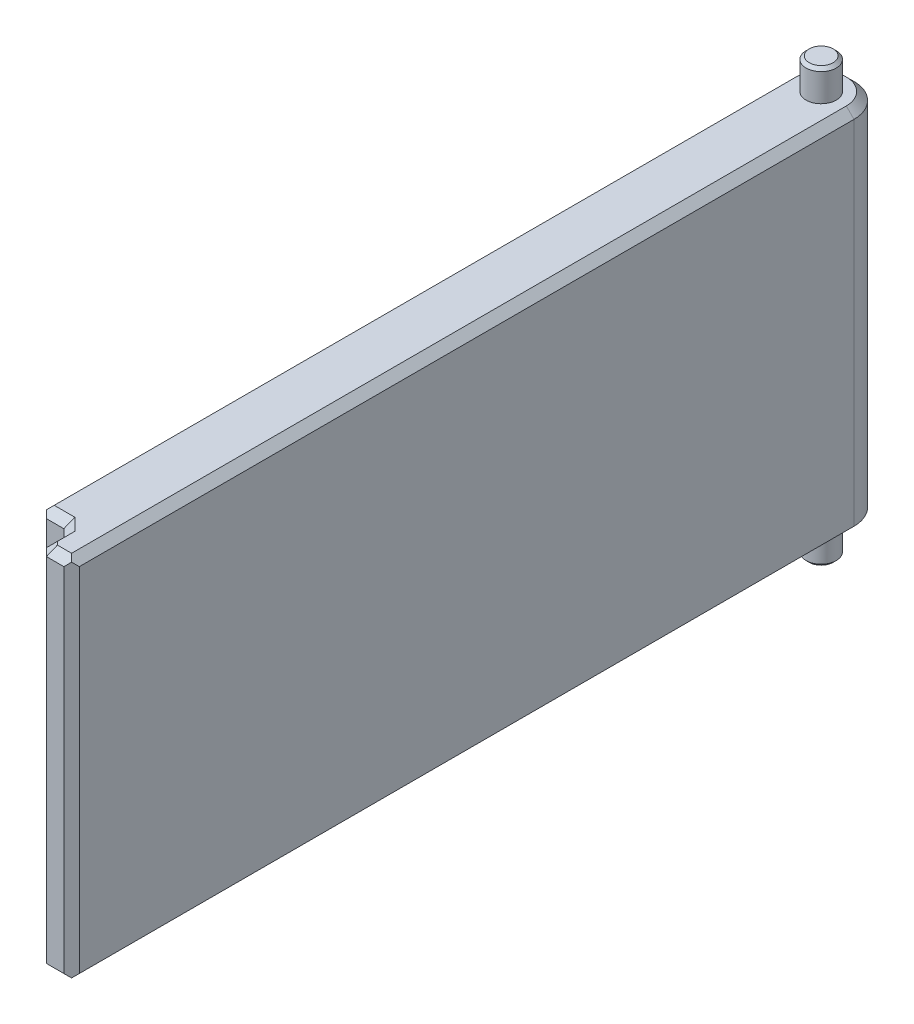
ISO-10303-21;
HEADER;
FILE_DESCRIPTION(('STEP AP214'),'2;1');
FILE_NAME('part.step','',(''),(''),'','','');
FILE_SCHEMA(('AUTOMOTIVE_DESIGN { 1 0 10303 214 1 1 1 1 }'));
ENDSEC;
DATA;
#1=APPLICATION_CONTEXT('core data for automotive mechanical design processes');
#2=APPLICATION_PROTOCOL_DEFINITION('international standard','automotive_design',2000,#1);
#3=PRODUCT_CONTEXT('',#1,'mechanical');
#4=PRODUCT('Part','Part','',(#3));
#5=PRODUCT_RELATED_PRODUCT_CATEGORY('part','',(#4));
#6=PRODUCT_DEFINITION_FORMATION('','',#4);
#7=PRODUCT_DEFINITION_CONTEXT('part definition',#1,'design');
#8=PRODUCT_DEFINITION('design','',#6,#7);
#9=PRODUCT_DEFINITION_SHAPE('','',#8);
#10=(LENGTH_UNIT() NAMED_UNIT(*) SI_UNIT(.MILLI.,.METRE.));
#11=(NAMED_UNIT(*) PLANE_ANGLE_UNIT() SI_UNIT($,.RADIAN.));
#12=(NAMED_UNIT(*) SI_UNIT($,.STERADIAN.) SOLID_ANGLE_UNIT());
#13=UNCERTAINTY_MEASURE_WITH_UNIT(LENGTH_MEASURE(1.E-05),#10,'distance_accuracy_value','');
#14=(GEOMETRIC_REPRESENTATION_CONTEXT(3) GLOBAL_UNCERTAINTY_ASSIGNED_CONTEXT((#13)) GLOBAL_UNIT_ASSIGNED_CONTEXT((#10,
#11,#12)) REPRESENTATION_CONTEXT('',''));
#15=CARTESIAN_POINT('',(0.,0.,0.));
#16=DIRECTION('',(0.,0.,1.));
#17=DIRECTION('',(1.,0.,0.));
#18=AXIS2_PLACEMENT_3D('',#15,#16,#17);
#19=CARTESIAN_POINT('',(0.,28.,0.));
#20=DIRECTION('',(0.,-1.,0.));
#21=DIRECTION('',(0.,0.,-1.));
#22=AXIS2_PLACEMENT_3D('',#19,#20,#21);
#23=CYLINDRICAL_SURFACE('',#22,0.975);
#24=CARTESIAN_POINT('',(0.,2.2,0.));
#25=DIRECTION('',(0.,-1.,0.));
#26=DIRECTION('',(0.,0.,-1.));
#27=AXIS2_PLACEMENT_3D('',#24,#25,#26);
#28=CIRCLE('',#27,0.975);
#29=CARTESIAN_POINT('',(0.,2.2,-0.975));
#30=VERTEX_POINT('',#29);
#31=EDGE_CURVE('E11',#30,#30,#28,.F.);
#32=ORIENTED_EDGE('',*,*,#31,.T.);
#33=EDGE_LOOP('',(#32));
#34=FACE_BOUND('',#33,.T.);
#35=CARTESIAN_POINT('',(0.,4.2,0.));
#36=DIRECTION('',(0.,1.,0.));
#37=DIRECTION('',(0.,0.,1.));
#38=AXIS2_PLACEMENT_3D('',#35,#36,#37);
#39=CIRCLE('',#38,0.975);
#40=CARTESIAN_POINT('',(0.,4.2,0.975));
#41=VERTEX_POINT('',#40);
#42=EDGE_CURVE('E192',#41,#41,#39,.T.);
#43=ORIENTED_EDGE('',*,*,#42,.F.);
#44=EDGE_LOOP('',(#43));
#45=FACE_BOUND('',#44,.T.);
#46=ADVANCED_FACE('F43',(#34,#45),#23,.T.);
#47=CARTESIAN_POINT('',(0.,4.2,50.625));
#48=DIRECTION('',(-1.,0.,0.));
#49=DIRECTION('',(0.,0.,1.));
#50=AXIS2_PLACEMENT_3D('',#47,#48,#49);
#51=PLANE('',#50);
#52=DIRECTION('',(0.,1.,0.));
#53=VECTOR('',#52,1.);
#54=CARTESIAN_POINT('',(0.,4.2,50.125));
#55=LINE('',#54,#53);
#56=CARTESIAN_POINT('',(0.,4.70000000000001,50.125));
#57=VERTEX_POINT('',#56);
#58=CARTESIAN_POINT('',(0.,27.5,50.125));
#59=VERTEX_POINT('',#58);
#60=EDGE_CURVE('E287',#57,#59,#55,.T.);
#61=ORIENTED_EDGE('',*,*,#60,.T.);
#62=DIRECTION('',(0.,0.,-1.));
#63=VECTOR('',#62,1.);
#64=CARTESIAN_POINT('',(0.,27.5,50.625));
#65=LINE('',#64,#63);
#66=CARTESIAN_POINT('',(0.,27.5,49.));
#67=VERTEX_POINT('',#66);
#68=EDGE_CURVE('E338',#59,#67,#65,.T.);
#69=ORIENTED_EDGE('',*,*,#68,.T.);
#70=DIRECTION('',(0.,-1.,0.));
#71=VECTOR('',#70,1.);
#72=CARTESIAN_POINT('',(0.,4.2,49.));
#73=LINE('',#72,#71);
#74=CARTESIAN_POINT('',(0.,4.70000000000001,49.));
#75=VERTEX_POINT('',#74);
#76=EDGE_CURVE('E291',#67,#75,#73,.T.);
#77=ORIENTED_EDGE('',*,*,#76,.T.);
#78=DIRECTION('',(0.,0.,1.));
#79=VECTOR('',#78,1.);
#80=CARTESIAN_POINT('',(0.,4.70000000000001,50.125));
#81=LINE('',#80,#79);
#82=EDGE_CURVE('E335',#75,#57,#81,.T.);
#83=ORIENTED_EDGE('',*,*,#82,.T.);
#84=EDGE_LOOP('',(#61,#69,#77,#83));
#85=FACE_BOUND('',#84,.T.);
#86=ADVANCED_FACE('F435',(#85),#51,.T.);
#87=CARTESIAN_POINT('',(0.,4.2,48.5));
#88=DIRECTION('',(0.,0.,1.));
#89=DIRECTION('',(1.,0.,0.));
#90=AXIS2_PLACEMENT_3D('',#87,#88,#89);
#91=PLANE('',#90);
#92=DIRECTION('',(0.,1.,0.));
#93=VECTOR('',#92,1.);
#94=CARTESIAN_POINT('',(-0.499999999999996,28.,48.5));
#95=LINE('',#94,#93);
#96=CARTESIAN_POINT('',(-0.499999999999996,4.70000000000001,48.5));
#97=VERTEX_POINT('',#96);
#98=CARTESIAN_POINT('',(-0.499999999999996,27.5,48.5));
#99=VERTEX_POINT('',#98);
#100=EDGE_CURVE('E283',#97,#99,#95,.T.);
#101=ORIENTED_EDGE('',*,*,#100,.T.);
#102=DIRECTION('',(-1.,0.,0.));
#103=VECTOR('',#102,1.);
#104=CARTESIAN_POINT('',(0.,27.5,48.5));
#105=LINE('',#104,#103);
#106=CARTESIAN_POINT('',(-1.62499999999999,27.5,48.5));
#107=VERTEX_POINT('',#106);
#108=EDGE_CURVE('E317',#99,#107,#105,.T.);
#109=ORIENTED_EDGE('',*,*,#108,.T.);
#110=DIRECTION('',(0.,-1.,0.));
#111=VECTOR('',#110,1.);
#112=CARTESIAN_POINT('',(-1.62499999999999,4.2,48.5));
#113=LINE('',#112,#111);
#114=CARTESIAN_POINT('',(-1.62499999999999,4.70000000000001,48.5));
#115=VERTEX_POINT('',#114);
#116=EDGE_CURVE('E262',#107,#115,#113,.T.);
#117=ORIENTED_EDGE('',*,*,#116,.T.);
#118=DIRECTION('',(1.,0.,0.));
#119=VECTOR('',#118,1.);
#120=CARTESIAN_POINT('',(-0.499999999999996,4.70000000000001,48.5));
#121=LINE('',#120,#119);
#122=EDGE_CURVE('E314',#115,#97,#121,.T.);
#123=ORIENTED_EDGE('',*,*,#122,.T.);
#124=EDGE_LOOP('',(#101,#109,#117,#123));
#125=FACE_BOUND('',#124,.T.);
#126=ADVANCED_FACE('F441',(#125),#91,.T.);
#127=CARTESIAN_POINT('',(-2.125,4.2,0.));
#128=DIRECTION('',(-1.,0.,0.));
#129=DIRECTION('',(0.,0.,1.));
#130=AXIS2_PLACEMENT_3D('',#127,#128,#129);
#131=PLANE('',#130);
#132=DIRECTION('',(0.,0.,1.));
#133=VECTOR('',#132,1.);
#134=CARTESIAN_POINT('',(-2.12499999999999,4.7000000000001,48.5));
#135=LINE('',#134,#133);
#136=CARTESIAN_POINT('',(-2.125,4.7000000000001,0.));
#137=VERTEX_POINT('',#136);
#138=CARTESIAN_POINT('',(-2.12499999999999,4.7000000000001,48.));
#139=VERTEX_POINT('',#138);
#140=EDGE_CURVE('E213',#137,#139,#135,.T.);
#141=ORIENTED_EDGE('',*,*,#140,.T.);
#142=DIRECTION('',(0.,1.,0.));
#143=VECTOR('',#142,1.);
#144=CARTESIAN_POINT('',(-2.12499999999999,4.2,48.));
#145=LINE('',#144,#143);
#146=CARTESIAN_POINT('',(-2.12499999999999,27.5,48.));
#147=VERTEX_POINT('',#146);
#148=EDGE_CURVE('E243',#139,#147,#145,.T.);
#149=ORIENTED_EDGE('',*,*,#148,.T.);
#150=DIRECTION('',(0.,0.,-1.));
#151=VECTOR('',#150,1.);
#152=CARTESIAN_POINT('',(-2.125,27.5,0.));
#153=LINE('',#152,#151);
#154=CARTESIAN_POINT('',(-2.125,27.5,0.));
#155=VERTEX_POINT('',#154);
#156=EDGE_CURVE('E220',#147,#155,#153,.T.);
#157=ORIENTED_EDGE('',*,*,#156,.T.);
#158=DIRECTION('',(0.,1.,0.));
#159=VECTOR('',#158,1.);
#160=CARTESIAN_POINT('',(-2.125,4.2,0.));
#161=LINE('',#160,#159);
#162=EDGE_CURVE('E636',#137,#155,#161,.T.);
#163=ORIENTED_EDGE('',*,*,#162,.F.);
#164=EDGE_LOOP('',(#141,#149,#157,#163));
#165=FACE_BOUND('',#164,.T.);
#166=ADVANCED_FACE('F600',(#165),#131,.T.);
#167=CARTESIAN_POINT('',(0.,4.2,0.));
#168=DIRECTION('',(0.,1.,0.));
#169=DIRECTION('',(0.,0.,1.));
#170=AXIS2_PLACEMENT_3D('',#167,#168,#169);
#171=CYLINDRICAL_SURFACE('',#170,2.125);
#172=ORIENTED_EDGE('',*,*,#162,.T.);
#173=CARTESIAN_POINT('',(0.,27.5,0.));
#174=DIRECTION('',(0.,1.,0.));
#175=DIRECTION('',(0.,0.,1.));
#176=AXIS2_PLACEMENT_3D('',#173,#174,#175);
#177=CIRCLE('',#176,2.125);
#178=CARTESIAN_POINT('',(2.125,27.5,0.));
#179=VERTEX_POINT('',#178);
#180=EDGE_CURVE('E226',#155,#179,#177,.F.);
#181=ORIENTED_EDGE('',*,*,#180,.T.);
#182=DIRECTION('',(0.,1.,0.));
#183=VECTOR('',#182,1.);
#184=CARTESIAN_POINT('',(2.125,4.2,0.));
#185=LINE('',#184,#183);
#186=CARTESIAN_POINT('',(2.125,4.7000000000001,0.));
#187=VERTEX_POINT('',#186);
#188=EDGE_CURVE('E637',#187,#179,#185,.T.);
#189=ORIENTED_EDGE('',*,*,#188,.F.);
#190=CARTESIAN_POINT('',(0.,4.7000000000001,0.));
#191=DIRECTION('',(0.,1.,0.));
#192=DIRECTION('',(0.,0.,1.));
#193=AXIS2_PLACEMENT_3D('',#190,#191,#192);
#194=CIRCLE('',#193,2.125);
#195=EDGE_CURVE('E223',#187,#137,#194,.T.);
#196=ORIENTED_EDGE('',*,*,#195,.T.);
#197=EDGE_LOOP('',(#172,#181,#189,#196));
#198=FACE_BOUND('',#197,.T.);
#199=ADVANCED_FACE('F635',(#198),#171,.T.);
#200=CARTESIAN_POINT('',(2.125,4.2,0.));
#201=DIRECTION('',(1.,0.,0.));
#202=DIRECTION('',(0.,0.,-1.));
#203=AXIS2_PLACEMENT_3D('',#200,#201,#202);
#204=PLANE('',#203);
#205=DIRECTION('',(0.,0.,1.));
#206=VECTOR('',#205,1.);
#207=CARTESIAN_POINT('',(2.125,27.5,0.));
#208=LINE('',#207,#206);
#209=CARTESIAN_POINT('',(2.12499999999999,27.5,50.125));
#210=VERTEX_POINT('',#209);
#211=EDGE_CURVE('E199',#179,#210,#208,.T.);
#212=ORIENTED_EDGE('',*,*,#211,.T.);
#213=DIRECTION('',(0.,-1.,0.));
#214=VECTOR('',#213,1.);
#215=CARTESIAN_POINT('',(2.12499999999999,4.2,50.125));
#216=LINE('',#215,#214);
#217=CARTESIAN_POINT('',(2.12499999999999,4.7000000000001,50.125));
#218=VERTEX_POINT('',#217);
#219=EDGE_CURVE('E276',#210,#218,#216,.T.);
#220=ORIENTED_EDGE('',*,*,#219,.T.);
#221=DIRECTION('',(0.,0.,-1.));
#222=VECTOR('',#221,1.);
#223=CARTESIAN_POINT('',(2.125,4.7000000000001,0.));
#224=LINE('',#223,#222);
#225=EDGE_CURVE('E229',#218,#187,#224,.T.);
#226=ORIENTED_EDGE('',*,*,#225,.T.);
#227=ORIENTED_EDGE('',*,*,#188,.T.);
#228=EDGE_LOOP('',(#212,#220,#226,#227));
#229=FACE_BOUND('',#228,.T.);
#230=ADVANCED_FACE('F625',(#229),#204,.T.);
#231=CARTESIAN_POINT('',(0.,4.2,50.625));
#232=DIRECTION('',(0.,0.,1.));
#233=DIRECTION('',(1.,0.,0.));
#234=AXIS2_PLACEMENT_3D('',#231,#232,#233);
#235=PLANE('',#234);
#236=DIRECTION('',(0.,1.,0.));
#237=VECTOR('',#236,1.);
#238=CARTESIAN_POINT('',(1.625,4.2,50.625));
#239=LINE('',#238,#237);
#240=CARTESIAN_POINT('',(1.625,4.70000000000001,50.625));
#241=VERTEX_POINT('',#240);
#242=CARTESIAN_POINT('',(1.625,27.5,50.625));
#243=VERTEX_POINT('',#242);
#244=EDGE_CURVE('E269',#241,#243,#239,.T.);
#245=ORIENTED_EDGE('',*,*,#244,.T.);
#246=DIRECTION('',(-1.,0.,0.));
#247=VECTOR('',#246,1.);
#248=CARTESIAN_POINT('',(0.,27.5,50.625));
#249=LINE('',#248,#247);
#250=CARTESIAN_POINT('',(0.500000000000019,27.5,50.625));
#251=VERTEX_POINT('',#250);
#252=EDGE_CURVE('E360',#243,#251,#249,.T.);
#253=ORIENTED_EDGE('',*,*,#252,.T.);
#254=DIRECTION('',(0.,-1.,0.));
#255=VECTOR('',#254,1.);
#256=CARTESIAN_POINT('',(0.500000000000019,4.2,50.625));
#257=LINE('',#256,#255);
#258=CARTESIAN_POINT('',(0.500000000000019,4.70000000000001,50.625));
#259=VERTEX_POINT('',#258);
#260=EDGE_CURVE('E295',#251,#259,#257,.T.);
#261=ORIENTED_EDGE('',*,*,#260,.T.);
#262=DIRECTION('',(1.,0.,0.));
#263=VECTOR('',#262,1.);
#264=CARTESIAN_POINT('',(1.62499999999989,4.70000000000001,50.625));
#265=LINE('',#264,#263);
#266=EDGE_CURVE('E356',#259,#241,#265,.T.);
#267=ORIENTED_EDGE('',*,*,#266,.T.);
#268=EDGE_LOOP('',(#245,#253,#261,#267));
#269=FACE_BOUND('',#268,.T.);
#270=ADVANCED_FACE('F660',(#269),#235,.T.);
#271=CARTESIAN_POINT('',(0.,4.2,0.));
#272=DIRECTION('',(0.,1.,0.));
#273=DIRECTION('',(0.,0.,1.));
#274=AXIS2_PLACEMENT_3D('',#271,#272,#273);
#275=PLANE('',#274);
#276=ORIENTED_EDGE('',*,*,#42,.T.);
#277=EDGE_LOOP('',(#276));
#278=FACE_BOUND('',#277,.T.);
#279=DIRECTION('',(0.,0.,1.));
#280=VECTOR('',#279,1.);
#281=CARTESIAN_POINT('',(1.62499999999989,4.2,50.625));
#282=LINE('',#281,#280);
#283=CARTESIAN_POINT('',(1.6249999999999,4.2,0.));
#284=VERTEX_POINT('',#283);
#285=CARTESIAN_POINT('',(1.62499999999989,4.2,50.125));
#286=VERTEX_POINT('',#285);
#287=EDGE_CURVE('E234',#284,#286,#282,.T.);
#288=ORIENTED_EDGE('',*,*,#287,.T.);
#289=DIRECTION('',(-1.,0.,0.));
#290=VECTOR('',#289,1.);
#291=CARTESIAN_POINT('',(0.500000000000019,4.2,50.125));
#292=LINE('',#291,#290);
#293=CARTESIAN_POINT('',(0.707106781186572,4.2,50.125));
#294=VERTEX_POINT('',#293);
#295=EDGE_CURVE('E60',#286,#294,#292,.T.);
#296=ORIENTED_EDGE('',*,*,#295,.T.);
#297=DIRECTION('',(-0.707106781186548,0.,-0.707106781186547));
#298=VECTOR('',#297,1.);
#299=CARTESIAN_POINT('',(0.353553390593292,4.2,49.7714466094067));
#300=LINE('',#299,#298);
#301=CARTESIAN_POINT('',(0.500000000000019,4.2,49.9178932188134));
#302=VERTEX_POINT('',#301);
#303=EDGE_CURVE('E64',#294,#302,#300,.T.);
#304=ORIENTED_EDGE('',*,*,#303,.T.);
#305=DIRECTION('',(0.,0.,-1.));
#306=VECTOR('',#305,1.);
#307=CARTESIAN_POINT('',(0.500000000000019,4.2,49.));
#308=LINE('',#307,#306);
#309=CARTESIAN_POINT('',(0.500000000000019,4.2,48.7928932188135));
#310=VERTEX_POINT('',#309);
#311=EDGE_CURVE('E372',#302,#310,#308,.T.);
#312=ORIENTED_EDGE('',*,*,#311,.T.);
#313=DIRECTION('',(-0.707106781186552,0.,-0.707106781186543));
#314=VECTOR('',#313,1.);
#315=CARTESIAN_POINT('',(-24.1464466094067,4.2,24.1464466094071));
#316=LINE('',#315,#314);
#317=CARTESIAN_POINT('',(-0.292893218813462,4.2,48.));
#318=VERTEX_POINT('',#317);
#319=EDGE_CURVE('E369',#310,#318,#316,.T.);
#320=ORIENTED_EDGE('',*,*,#319,.T.);
#321=DIRECTION('',(-1.,0.,0.));
#322=VECTOR('',#321,1.);
#323=CARTESIAN_POINT('',(-1.62499999999989,4.2,48.));
#324=LINE('',#323,#322);
#325=CARTESIAN_POINT('',(-1.62499999999989,4.2,48.));
#326=VERTEX_POINT('',#325);
#327=EDGE_CURVE('E366',#318,#326,#324,.T.);
#328=ORIENTED_EDGE('',*,*,#327,.T.);
#329=DIRECTION('',(0.,0.,-1.));
#330=VECTOR('',#329,1.);
#331=CARTESIAN_POINT('',(-1.6249999999999,4.2,0.));
#332=LINE('',#331,#330);
#333=CARTESIAN_POINT('',(-1.6249999999999,4.2,0.));
#334=VERTEX_POINT('',#333);
#335=EDGE_CURVE('E240',#326,#334,#332,.T.);
#336=ORIENTED_EDGE('',*,*,#335,.T.);
#337=CARTESIAN_POINT('',(0.,4.2,0.));
#338=DIRECTION('',(0.,1.,0.));
#339=DIRECTION('',(0.,0.,1.));
#340=AXIS2_PLACEMENT_3D('',#337,#338,#339);
#341=CIRCLE('',#340,1.6249999999999);
#342=EDGE_CURVE('E237',#334,#284,#341,.F.);
#343=ORIENTED_EDGE('',*,*,#342,.T.);
#344=EDGE_LOOP('',(#288,#296,#304,#312,#320,#328,#336,#343));
#345=FACE_BOUND('',#344,.T.);
#346=ADVANCED_FACE('F652',(#278,#345),#275,.F.);
#347=CARTESIAN_POINT('',(0.,28.,0.));
#348=DIRECTION('',(0.,1.,0.));
#349=DIRECTION('',(0.,0.,1.));
#350=AXIS2_PLACEMENT_3D('',#347,#348,#349);
#351=PLANE('',#350);
#352=CARTESIAN_POINT('',(0.,28.,0.));
#353=DIRECTION('',(0.,1.,0.));
#354=DIRECTION('',(0.,0.,1.));
#355=AXIS2_PLACEMENT_3D('',#352,#353,#354);
#356=CIRCLE('',#355,0.975);
#357=CARTESIAN_POINT('',(0.,28.,0.975));
#358=VERTEX_POINT('',#357);
#359=EDGE_CURVE('E203',#358,#358,#356,.T.);
#360=ORIENTED_EDGE('',*,*,#359,.F.);
#361=EDGE_LOOP('',(#360));
#362=FACE_BOUND('',#361,.T.);
#363=DIRECTION('',(0.,0.,1.));
#364=VECTOR('',#363,1.);
#365=CARTESIAN_POINT('',(-1.62499999999999,28.,0.));
#366=LINE('',#365,#364);
#367=CARTESIAN_POINT('',(-1.62499999999999,28.,0.));
#368=VERTEX_POINT('',#367);
#369=CARTESIAN_POINT('',(-1.62499999999999,28.,48.));
#370=VERTEX_POINT('',#369);
#371=EDGE_CURVE('E210',#368,#370,#366,.T.);
#372=ORIENTED_EDGE('',*,*,#371,.T.);
#373=DIRECTION('',(1.,0.,0.));
#374=VECTOR('',#373,1.);
#375=CARTESIAN_POINT('',(0.,28.,48.));
#376=LINE('',#375,#374);
#377=CARTESIAN_POINT('',(-0.292893218813462,28.,48.));
#378=VERTEX_POINT('',#377);
#379=EDGE_CURVE('E310',#370,#378,#376,.T.);
#380=ORIENTED_EDGE('',*,*,#379,.T.);
#381=DIRECTION('',(0.707106781186552,0.,0.707106781186543));
#382=VECTOR('',#381,1.);
#383=CARTESIAN_POINT('',(0.353553390593282,28.,48.6464466094067));
#384=LINE('',#383,#382);
#385=CARTESIAN_POINT('',(0.500000000000019,28.,48.7928932188135));
#386=VERTEX_POINT('',#385);
#387=EDGE_CURVE('E307',#378,#386,#384,.T.);
#388=ORIENTED_EDGE('',*,*,#387,.T.);
#389=DIRECTION('',(0.,0.,1.));
#390=VECTOR('',#389,1.);
#391=CARTESIAN_POINT('',(0.500000000000017,28.,0.));
#392=LINE('',#391,#390);
#393=CARTESIAN_POINT('',(0.500000000000019,28.,49.9178932188134));
#394=VERTEX_POINT('',#393);
#395=EDGE_CURVE('E304',#386,#394,#392,.T.);
#396=ORIENTED_EDGE('',*,*,#395,.T.);
#397=DIRECTION('',(0.707106781186548,0.,0.707106781186547));
#398=VECTOR('',#397,1.);
#399=CARTESIAN_POINT('',(-24.7089466094067,28.,24.7089466094067));
#400=LINE('',#399,#398);
#401=CARTESIAN_POINT('',(0.707106781186572,28.,50.125));
#402=VERTEX_POINT('',#401);
#403=EDGE_CURVE('E301',#394,#402,#400,.T.);
#404=ORIENTED_EDGE('',*,*,#403,.T.);
#405=DIRECTION('',(1.,0.,0.));
#406=VECTOR('',#405,1.);
#407=CARTESIAN_POINT('',(0.,28.,50.125));
#408=LINE('',#407,#406);
#409=CARTESIAN_POINT('',(1.62499999999999,28.,50.125));
#410=VERTEX_POINT('',#409);
#411=EDGE_CURVE('E188',#402,#410,#408,.T.);
#412=ORIENTED_EDGE('',*,*,#411,.T.);
#413=DIRECTION('',(0.,0.,-1.));
#414=VECTOR('',#413,1.);
#415=CARTESIAN_POINT('',(1.62499999999999,28.,0.));
#416=LINE('',#415,#414);
#417=CARTESIAN_POINT('',(1.62499999999999,28.,0.));
#418=VERTEX_POINT('',#417);
#419=EDGE_CURVE('E180',#410,#418,#416,.T.);
#420=ORIENTED_EDGE('',*,*,#419,.T.);
#421=CARTESIAN_POINT('',(0.,28.,0.));
#422=DIRECTION('',(0.,1.,0.));
#423=DIRECTION('',(0.,0.,1.));
#424=AXIS2_PLACEMENT_3D('',#421,#422,#423);
#425=CIRCLE('',#424,1.62499999999999);
#426=EDGE_CURVE('E185',#418,#368,#425,.T.);
#427=ORIENTED_EDGE('',*,*,#426,.T.);
#428=EDGE_LOOP('',(#372,#380,#388,#396,#404,#412,#420,#427));
#429=FACE_BOUND('',#428,.T.);
#430=ADVANCED_FACE('F183',(#362,#429),#351,.T.);
#431=CARTESIAN_POINT('',(0.,30.,0.));
#432=DIRECTION('',(0.,-1.,0.));
#433=DIRECTION('',(0.,0.,-1.));
#434=AXIS2_PLACEMENT_3D('',#431,#432,#433);
#435=CYLINDRICAL_SURFACE('',#434,0.975);
#436=CARTESIAN_POINT('',(0.,29.8,0.));
#437=DIRECTION('',(0.,1.,0.));
#438=DIRECTION('',(0.,0.,1.));
#439=AXIS2_PLACEMENT_3D('',#436,#437,#438);
#440=CIRCLE('',#439,0.975);
#441=CARTESIAN_POINT('',(0.,29.8,0.975));
#442=VERTEX_POINT('',#441);
#443=EDGE_CURVE('E416',#442,#442,#440,.F.);
#444=ORIENTED_EDGE('',*,*,#443,.T.);
#445=EDGE_LOOP('',(#444));
#446=FACE_BOUND('',#445,.T.);
#447=ORIENTED_EDGE('',*,*,#359,.T.);
#448=EDGE_LOOP('',(#447));
#449=FACE_BOUND('',#448,.T.);
#450=ADVANCED_FACE('F649',(#446,#449),#435,.T.);
#451=CARTESIAN_POINT('',(0.,30.,0.));
#452=DIRECTION('',(0.,1.,0.));
#453=DIRECTION('',(0.,0.,1.));
#454=AXIS2_PLACEMENT_3D('',#451,#452,#453);
#455=PLANE('',#454);
#456=CARTESIAN_POINT('',(0.,30.,0.));
#457=DIRECTION('',(0.,1.,0.));
#458=DIRECTION('',(0.,0.,1.));
#459=AXIS2_PLACEMENT_3D('',#456,#457,#458);
#460=CIRCLE('',#459,0.775000000000005);
#461=CARTESIAN_POINT('',(0.,30.,0.775000000000005));
#462=VERTEX_POINT('',#461);
#463=EDGE_CURVE('E382',#462,#462,#460,.T.);
#464=ORIENTED_EDGE('',*,*,#463,.T.);
#465=EDGE_LOOP('',(#464));
#466=FACE_BOUND('',#465,.T.);
#467=ADVANCED_FACE('F657',(#466),#455,.T.);
#468=CARTESIAN_POINT('',(0.,2.,0.));
#469=DIRECTION('',(0.,-1.,0.));
#470=DIRECTION('',(0.,0.,-1.));
#471=AXIS2_PLACEMENT_3D('',#468,#469,#470);
#472=PLANE('',#471);
#473=CARTESIAN_POINT('',(0.,2.,0.));
#474=DIRECTION('',(0.,-1.,0.));
#475=DIRECTION('',(0.,0.,-1.));
#476=AXIS2_PLACEMENT_3D('',#473,#474,#475);
#477=CIRCLE('',#476,0.775);
#478=CARTESIAN_POINT('',(0.,2.,-0.775));
#479=VERTEX_POINT('',#478);
#480=EDGE_CURVE('E53',#479,#479,#477,.T.);
#481=ORIENTED_EDGE('',*,*,#480,.T.);
#482=EDGE_LOOP('',(#481));
#483=FACE_BOUND('',#482,.T.);
#484=ADVANCED_FACE('F423',(#483),#472,.T.);
#485=CARTESIAN_POINT('',(1.62499999999999,28.,0.));
#486=DIRECTION('',(-0.707106781186547,-0.707106781186547,0.));
#487=DIRECTION('',(0.,0.,-1.));
#488=AXIS2_PLACEMENT_3D('',#485,#486,#487);
#489=PLANE('',#488);
#490=ORIENTED_EDGE('',*,*,#419,.F.);
#491=DIRECTION('',(0.577350269189626,-0.577350269189626,0.577350269189626));
#492=VECTOR('',#491,1.);
#493=CARTESIAN_POINT('',(-15.0833333333333,44.7083333333333,33.4166666666667));
#494=LINE('',#493,#492);
#495=CARTESIAN_POINT('',(1.87499999999999,27.75,50.375));
#496=VERTEX_POINT('',#495);
#497=EDGE_CURVE('E347',#410,#496,#494,.T.);
#498=ORIENTED_EDGE('',*,*,#497,.T.);
#499=DIRECTION('',(0.577350269189626,-0.577350269189626,-0.577350269189626));
#500=VECTOR('',#499,1.);
#501=CARTESIAN_POINT('',(18.5,11.125,33.75));
#502=LINE('',#501,#500);
#503=EDGE_CURVE('E273',#496,#210,#502,.T.);
#504=ORIENTED_EDGE('',*,*,#503,.T.);
#505=ORIENTED_EDGE('',*,*,#211,.F.);
#506=DIRECTION('',(0.707106781186547,-0.707106781186547,0.));
#507=VECTOR('',#506,1.);
#508=CARTESIAN_POINT('',(1.62499999999999,28.,0.));
#509=LINE('',#508,#507);
#510=EDGE_CURVE('E196',#418,#179,#509,.T.);
#511=ORIENTED_EDGE('',*,*,#510,.F.);
#512=EDGE_LOOP('',(#490,#498,#504,#505,#511));
#513=FACE_BOUND('',#512,.T.);
#514=ADVANCED_FACE('F197',(#513),#489,.F.);
#515=CARTESIAN_POINT('',(0.,28.,0.));
#516=DIRECTION('',(0.,-1.,0.));
#517=DIRECTION('',(0.,0.,-1.));
#518=AXIS2_PLACEMENT_3D('',#515,#516,#517);
#519=CONICAL_SURFACE('',#518,1.62499999999999,0.785398163397448);
#520=ORIENTED_EDGE('',*,*,#510,.T.);
#521=ORIENTED_EDGE('',*,*,#180,.F.);
#522=DIRECTION('',(-0.707106781186547,-0.707106781186547,0.));
#523=VECTOR('',#522,1.);
#524=CARTESIAN_POINT('',(-1.62499999999999,28.,0.));
#525=LINE('',#524,#523);
#526=EDGE_CURVE('E204',#368,#155,#525,.T.);
#527=ORIENTED_EDGE('',*,*,#526,.F.);
#528=ORIENTED_EDGE('',*,*,#426,.F.);
#529=EDGE_LOOP('',(#520,#521,#527,#528));
#530=FACE_BOUND('',#529,.T.);
#531=ADVANCED_FACE('F206',(#530),#519,.T.);
#532=CARTESIAN_POINT('',(-1.62499999999999,28.,0.));
#533=DIRECTION('',(0.707106781186548,-0.707106781186547,0.));
#534=DIRECTION('',(0.,0.,1.));
#535=AXIS2_PLACEMENT_3D('',#532,#533,#534);
#536=PLANE('',#535);
#537=DIRECTION('',(0.577350269189626,0.577350269189626,0.577350269189626));
#538=VECTOR('',#537,1.);
#539=CARTESIAN_POINT('',(-17.7916666666667,11.8333333333333,32.3333333333333));
#540=LINE('',#539,#538);
#541=CARTESIAN_POINT('',(-1.87499999999999,27.75,48.25));
#542=VERTEX_POINT('',#541);
#543=EDGE_CURVE('E258',#147,#542,#540,.T.);
#544=ORIENTED_EDGE('',*,*,#543,.T.);
#545=DIRECTION('',(0.577350269189626,0.577350269189626,-0.577350269189626));
#546=VECTOR('',#545,1.);
#547=CARTESIAN_POINT('',(14.375,44.,32.));
#548=LINE('',#547,#546);
#549=EDGE_CURVE('E326',#542,#370,#548,.T.);
#550=ORIENTED_EDGE('',*,*,#549,.T.);
#551=ORIENTED_EDGE('',*,*,#371,.F.);
#552=ORIENTED_EDGE('',*,*,#526,.T.);
#553=ORIENTED_EDGE('',*,*,#156,.F.);
#554=EDGE_LOOP('',(#544,#550,#551,#552,#553));
#555=FACE_BOUND('',#554,.T.);
#556=ADVANCED_FACE('F448',(#555),#536,.F.);
#557=CARTESIAN_POINT('',(2.125,4.7000000000001,0.));
#558=DIRECTION('',(0.707106781186543,-0.707106781186552,0.));
#559=DIRECTION('',(0.,0.,1.));
#560=AXIS2_PLACEMENT_3D('',#557,#558,#559);
#561=PLANE('',#560);
#562=DIRECTION('',(0.577350269189629,0.577350269189621,-0.577350269189629));
#563=VECTOR('',#562,1.);
#564=CARTESIAN_POINT('',(18.8333333333335,21.4083333333334,33.4166666666665));
#565=LINE('',#564,#563);
#566=CARTESIAN_POINT('',(1.87499999999994,4.45000000000005,50.3750000000001));
#567=VERTEX_POINT('',#566);
#568=EDGE_CURVE('E279',#218,#567,#565,.F.);
#569=ORIENTED_EDGE('',*,*,#568,.T.);
#570=DIRECTION('',(-0.577350269189631,-0.577350269189623,-0.577350269189623));
#571=VECTOR('',#570,1.);
#572=CARTESIAN_POINT('',(-14.7500000000001,-12.1749999999998,33.7500000000002));
#573=LINE('',#572,#571);
#574=EDGE_CURVE('E363',#567,#286,#573,.T.);
#575=ORIENTED_EDGE('',*,*,#574,.T.);
#576=ORIENTED_EDGE('',*,*,#287,.F.);
#577=DIRECTION('',(-0.707106781186552,-0.707106781186543,0.));
#578=VECTOR('',#577,1.);
#579=CARTESIAN_POINT('',(2.125,4.7000000000001,0.));
#580=LINE('',#579,#578);
#581=EDGE_CURVE('E245',#187,#284,#580,.T.);
#582=ORIENTED_EDGE('',*,*,#581,.F.);
#583=ORIENTED_EDGE('',*,*,#225,.F.);
#584=EDGE_LOOP('',(#569,#575,#576,#582,#583));
#585=FACE_BOUND('',#584,.T.);
#586=ADVANCED_FACE('F455',(#585),#561,.T.);
#587=CARTESIAN_POINT('',(0.,4.7000000000001,0.));
#588=DIRECTION('',(0.,1.,0.));
#589=DIRECTION('',(0.,0.,1.));
#590=AXIS2_PLACEMENT_3D('',#587,#588,#589);
#591=CONICAL_SURFACE('',#590,2.125,0.785398163397455);
#592=ORIENTED_EDGE('',*,*,#581,.T.);
#593=ORIENTED_EDGE('',*,*,#342,.F.);
#594=DIRECTION('',(0.707106781186552,-0.707106781186543,0.));
#595=VECTOR('',#594,1.);
#596=CARTESIAN_POINT('',(-2.125,4.7000000000001,0.));
#597=LINE('',#596,#595);
#598=EDGE_CURVE('E247',#137,#334,#597,.T.);
#599=ORIENTED_EDGE('',*,*,#598,.F.);
#600=ORIENTED_EDGE('',*,*,#195,.F.);
#601=EDGE_LOOP('',(#592,#593,#599,#600));
#602=FACE_BOUND('',#601,.T.);
#603=ADVANCED_FACE('F475',(#602),#591,.T.);
#604=CARTESIAN_POINT('',(-2.125,4.7000000000001,0.));
#605=DIRECTION('',(-0.707106781186543,-0.707106781186552,0.));
#606=DIRECTION('',(0.,0.,-1.));
#607=AXIS2_PLACEMENT_3D('',#604,#605,#606);
#608=PLANE('',#607);
#609=ORIENTED_EDGE('',*,*,#335,.F.);
#610=DIRECTION('',(-0.577350269189631,0.577350269189623,0.577350269189623));
#611=VECTOR('',#610,1.);
#612=CARTESIAN_POINT('',(14.0416666666668,-11.4666666666665,32.3333333333335));
#613=LINE('',#612,#611);
#614=CARTESIAN_POINT('',(-1.87499999999995,4.45000000000005,48.25));
#615=VERTEX_POINT('',#614);
#616=EDGE_CURVE('E379',#326,#615,#613,.T.);
#617=ORIENTED_EDGE('',*,*,#616,.T.);
#618=DIRECTION('',(0.577350269189628,-0.577350269189621,0.577350269189628));
#619=VECTOR('',#618,1.);
#620=CARTESIAN_POINT('',(-18.1250000000001,20.7,31.9999999999998));
#621=LINE('',#620,#619);
#622=EDGE_CURVE('E266',#615,#139,#621,.F.);
#623=ORIENTED_EDGE('',*,*,#622,.T.);
#624=ORIENTED_EDGE('',*,*,#140,.F.);
#625=ORIENTED_EDGE('',*,*,#598,.T.);
#626=EDGE_LOOP('',(#609,#617,#623,#624,#625));
#627=FACE_BOUND('',#626,.T.);
#628=ADVANCED_FACE('F467',(#627),#608,.T.);
#629=CARTESIAN_POINT('',(-2.12499999999999,4.2,48.));
#630=DIRECTION('',(0.707106781186548,0.,-0.707106781186547));
#631=DIRECTION('',(0.,1.,0.));
#632=AXIS2_PLACEMENT_3D('',#629,#630,#631);
#633=PLANE('',#632);
#634=ORIENTED_EDGE('',*,*,#116,.F.);
#635=DIRECTION('',(-0.577350269189626,0.577350269189626,-0.577350269189626));
#636=VECTOR('',#635,1.);
#637=CARTESIAN_POINT('',(5.80833333333334,20.0666666666667,55.9333333333333));
#638=LINE('',#637,#636);
#639=EDGE_CURVE('E323',#107,#542,#638,.T.);
#640=ORIENTED_EDGE('',*,*,#639,.T.);
#641=ORIENTED_EDGE('',*,*,#543,.F.);
#642=ORIENTED_EDGE('',*,*,#148,.F.);
#643=ORIENTED_EDGE('',*,*,#622,.F.);
#644=DIRECTION('',(-0.577350269189626,-0.577350269189626,-0.577350269189626));
#645=VECTOR('',#644,1.);
#646=CARTESIAN_POINT('',(-2.12499999999999,4.2,48.));
#647=LINE('',#646,#645);
#648=EDGE_CURVE('E320',#615,#115,#647,.F.);
#649=ORIENTED_EDGE('',*,*,#648,.T.);
#650=EDGE_LOOP('',(#634,#640,#641,#642,#643,#649));
#651=FACE_BOUND('',#650,.T.);
#652=ADVANCED_FACE('F474',(#651),#633,.F.);
#653=CARTESIAN_POINT('',(1.625,4.2,50.625));
#654=DIRECTION('',(-0.707106781186547,0.,-0.707106781186547));
#655=DIRECTION('',(0.,1.,0.));
#656=AXIS2_PLACEMENT_3D('',#653,#654,#655);
#657=PLANE('',#656);
#658=ORIENTED_EDGE('',*,*,#503,.F.);
#659=DIRECTION('',(-0.577350269189626,-0.577350269189626,0.577350269189626));
#660=VECTOR('',#659,1.);
#661=CARTESIAN_POINT('',(-6.14166666666666,19.7333333333333,58.3916666666667));
#662=LINE('',#661,#660);
#663=EDGE_CURVE('E353',#496,#243,#662,.T.);
#664=ORIENTED_EDGE('',*,*,#663,.T.);
#665=ORIENTED_EDGE('',*,*,#244,.F.);
#666=DIRECTION('',(-0.577350269189626,0.577350269189626,0.577350269189626));
#667=VECTOR('',#666,1.);
#668=CARTESIAN_POINT('',(1.79166666666667,4.53333333333334,50.4583333333333));
#669=LINE('',#668,#667);
#670=EDGE_CURVE('E350',#241,#567,#669,.F.);
#671=ORIENTED_EDGE('',*,*,#670,.T.);
#672=ORIENTED_EDGE('',*,*,#568,.F.);
#673=ORIENTED_EDGE('',*,*,#219,.F.);
#674=EDGE_LOOP('',(#658,#664,#665,#671,#672,#673));
#675=FACE_BOUND('',#674,.T.);
#676=ADVANCED_FACE('F492',(#675),#657,.F.);
#677=CARTESIAN_POINT('',(-0.499999999999996,4.2,48.5));
#678=DIRECTION('',(-0.707106781186543,0.,0.707106781186552));
#679=DIRECTION('',(0.,-1.,0.));
#680=AXIS2_PLACEMENT_3D('',#677,#678,#679);
#681=PLANE('',#680);
#682=ORIENTED_EDGE('',*,*,#76,.F.);
#683=DIRECTION('',(0.707106781186552,0.,0.707106781186543));
#684=VECTOR('',#683,1.);
#685=CARTESIAN_POINT('',(-0.499999999999996,27.5,48.5));
#686=LINE('',#685,#684);
#687=EDGE_CURVE('E332',#67,#99,#686,.F.);
#688=ORIENTED_EDGE('',*,*,#687,.T.);
#689=ORIENTED_EDGE('',*,*,#100,.F.);
#690=DIRECTION('',(-0.707106781186552,0.,-0.707106781186543));
#691=VECTOR('',#690,1.);
#692=CARTESIAN_POINT('',(-0.499999999999996,4.70000000000001,48.5));
#693=LINE('',#692,#691);
#694=EDGE_CURVE('E329',#97,#75,#693,.F.);
#695=ORIENTED_EDGE('',*,*,#694,.T.);
#696=EDGE_LOOP('',(#682,#688,#689,#695));
#697=FACE_BOUND('',#696,.T.);
#698=ADVANCED_FACE('F499',(#697),#681,.T.);
#699=CARTESIAN_POINT('',(0.,4.2,50.125));
#700=DIRECTION('',(0.707106781186547,0.,-0.707106781186548));
#701=DIRECTION('',(0.,1.,0.));
#702=AXIS2_PLACEMENT_3D('',#699,#700,#701);
#703=PLANE('',#702);
#704=ORIENTED_EDGE('',*,*,#260,.F.);
#705=DIRECTION('',(0.707106781186548,0.,0.707106781186547));
#706=VECTOR('',#705,1.);
#707=CARTESIAN_POINT('',(0.,27.5,50.125));
#708=LINE('',#707,#706);
#709=EDGE_CURVE('E344',#251,#59,#708,.F.);
#710=ORIENTED_EDGE('',*,*,#709,.T.);
#711=ORIENTED_EDGE('',*,*,#60,.F.);
#712=DIRECTION('',(-0.707106781186548,0.,-0.707106781186547));
#713=VECTOR('',#712,1.);
#714=CARTESIAN_POINT('',(0.500000000000019,4.70000000000001,50.625));
#715=LINE('',#714,#713);
#716=EDGE_CURVE('E341',#57,#259,#715,.F.);
#717=ORIENTED_EDGE('',*,*,#716,.T.);
#718=EDGE_LOOP('',(#704,#710,#711,#717));
#719=FACE_BOUND('',#718,.T.);
#720=ADVANCED_FACE('F506',(#719),#703,.F.);
#721=CARTESIAN_POINT('',(0.,28.,50.125));
#722=DIRECTION('',(0.,-0.707106781186547,-0.707106781186547));
#723=DIRECTION('',(1.,0.,0.));
#724=AXIS2_PLACEMENT_3D('',#721,#722,#723);
#725=PLANE('',#724);
#726=ORIENTED_EDGE('',*,*,#497,.F.);
#727=ORIENTED_EDGE('',*,*,#411,.F.);
#728=DIRECTION('',(0.281084637714832,0.678598344545845,-0.678598344545845));
#729=VECTOR('',#728,1.);
#730=CARTESIAN_POINT('',(0.651239283050933,27.8651239283051,50.2598760716949));
#731=LINE('',#730,#729);
#732=EDGE_CURVE('E251',#251,#402,#731,.T.);
#733=ORIENTED_EDGE('',*,*,#732,.F.);
#734=ORIENTED_EDGE('',*,*,#252,.F.);
#735=ORIENTED_EDGE('',*,*,#663,.F.);
#736=EDGE_LOOP('',(#726,#727,#733,#734,#735));
#737=FACE_BOUND('',#736,.T.);
#738=ADVANCED_FACE('F513',(#737),#725,.F.);
#739=CARTESIAN_POINT('',(-24.7089466094067,28.,24.7089466094067));
#740=DIRECTION('',(-0.499999999999996,0.707106781186552,0.499999999999997));
#741=DIRECTION('',(-0.707106781186548,0.,-0.707106781186547));
#742=AXIS2_PLACEMENT_3D('',#739,#740,#741);
#743=PLANE('',#742);
#744=ORIENTED_EDGE('',*,*,#732,.T.);
#745=ORIENTED_EDGE('',*,*,#403,.F.);
#746=DIRECTION('',(0.678598344545845,0.678598344545845,-0.281084637714832));
#747=VECTOR('',#746,1.);
#748=CARTESIAN_POINT('',(-6.30016738048665,21.1998326195133,52.7346147742183));
#749=LINE('',#748,#747);
#750=EDGE_CURVE('E391',#59,#394,#749,.T.);
#751=ORIENTED_EDGE('',*,*,#750,.F.);
#752=ORIENTED_EDGE('',*,*,#709,.F.);
#753=EDGE_LOOP('',(#744,#745,#751,#752));
#754=FACE_BOUND('',#753,.T.);
#755=ADVANCED_FACE('F538',(#754),#743,.T.);
#756=CARTESIAN_POINT('',(0.500000000000017,28.,0.));
#757=DIRECTION('',(0.707106781186547,-0.707106781186547,0.));
#758=DIRECTION('',(0.,0.,1.));
#759=AXIS2_PLACEMENT_3D('',#756,#757,#758);
#760=PLANE('',#759);
#761=ORIENTED_EDGE('',*,*,#750,.T.);
#762=ORIENTED_EDGE('',*,*,#395,.F.);
#763=DIRECTION('',(-0.67859834454585,-0.67859834454585,0.281084637714804));
#764=VECTOR('',#763,1.);
#765=CARTESIAN_POINT('',(-6.14843179983058,21.3515682001694,51.5467638388157));
#766=LINE('',#765,#764);
#767=EDGE_CURVE('E386',#67,#386,#766,.F.);
#768=ORIENTED_EDGE('',*,*,#767,.F.);
#769=ORIENTED_EDGE('',*,*,#68,.F.);
#770=EDGE_LOOP('',(#761,#762,#768,#769));
#771=FACE_BOUND('',#770,.T.);
#772=ADVANCED_FACE('F531',(#771),#760,.F.);
#773=CARTESIAN_POINT('',(-24.1464466094067,28.,24.1464466094071));
#774=DIRECTION('',(0.500000000000002,-0.70710678118654,-0.500000000000009));
#775=DIRECTION('',(0.707106781186552,0.,0.707106781186543));
#776=AXIS2_PLACEMENT_3D('',#773,#774,#775);
#777=PLANE('',#776);
#778=ORIENTED_EDGE('',*,*,#767,.T.);
#779=ORIENTED_EDGE('',*,*,#387,.F.);
#780=DIRECTION('',(-0.281084637714799,-0.678598344545851,0.678598344545851));
#781=VECTOR('',#780,1.);
#782=CARTESIAN_POINT('',(-0.269752143389827,28.0558674981356,47.9441325018644));
#783=LINE('',#782,#781);
#784=EDGE_CURVE('E383',#99,#378,#783,.F.);
#785=ORIENTED_EDGE('',*,*,#784,.F.);
#786=ORIENTED_EDGE('',*,*,#687,.F.);
#787=EDGE_LOOP('',(#778,#779,#785,#786));
#788=FACE_BOUND('',#787,.T.);
#789=ADVANCED_FACE('F524',(#788),#777,.F.);
#790=CARTESIAN_POINT('',(0.,28.,48.));
#791=DIRECTION('',(0.,-0.707106781186547,-0.707106781186547));
#792=DIRECTION('',(1.,0.,0.));
#793=AXIS2_PLACEMENT_3D('',#790,#791,#792);
#794=PLANE('',#793);
#795=ORIENTED_EDGE('',*,*,#639,.F.);
#796=ORIENTED_EDGE('',*,*,#108,.F.);
#797=ORIENTED_EDGE('',*,*,#784,.T.);
#798=ORIENTED_EDGE('',*,*,#379,.F.);
#799=ORIENTED_EDGE('',*,*,#549,.F.);
#800=EDGE_LOOP('',(#795,#796,#797,#798,#799));
#801=FACE_BOUND('',#800,.T.);
#802=ADVANCED_FACE('F516',(#801),#794,.F.);
#803=CARTESIAN_POINT('',(0.,4.70000000000001,48.5));
#804=DIRECTION('',(0.,-0.707106781186547,0.707106781186547));
#805=DIRECTION('',(-1.,0.,0.));
#806=AXIS2_PLACEMENT_3D('',#803,#804,#805);
#807=PLANE('',#806);
#808=ORIENTED_EDGE('',*,*,#616,.F.);
#809=ORIENTED_EDGE('',*,*,#327,.F.);
#810=DIRECTION('',(-0.281084637714799,0.678598344545851,0.678598344545851));
#811=VECTOR('',#810,1.);
#812=CARTESIAN_POINT('',(2.37238348034103,-2.23454715457629,41.5654528454237));
#813=LINE('',#812,#811);
#814=EDGE_CURVE('E387',#97,#318,#813,.F.);
#815=ORIENTED_EDGE('',*,*,#814,.F.);
#816=ORIENTED_EDGE('',*,*,#122,.F.);
#817=ORIENTED_EDGE('',*,*,#648,.F.);
#818=EDGE_LOOP('',(#808,#809,#815,#816,#817));
#819=FACE_BOUND('',#818,.T.);
#820=ADVANCED_FACE('F523',(#819),#807,.T.);
#821=CARTESIAN_POINT('',(-24.1464466094067,4.2,24.1464466094071));
#822=DIRECTION('',(-0.500000000000002,-0.70710678118654,0.500000000000009));
#823=DIRECTION('',(0.707106781186552,0.,0.707106781186543));
#824=AXIS2_PLACEMENT_3D('',#821,#822,#823);
#825=PLANE('',#824);
#826=ORIENTED_EDGE('',*,*,#814,.T.);
#827=ORIENTED_EDGE('',*,*,#319,.F.);
#828=DIRECTION('',(-0.67859834454585,0.67859834454585,0.281084637714804));
#829=VECTOR('',#828,1.);
#830=CARTESIAN_POINT('',(-0.30995830097461,5.00995830097463,49.1283889320338));
#831=LINE('',#830,#829);
#832=EDGE_CURVE('E406',#75,#310,#831,.F.);
#833=ORIENTED_EDGE('',*,*,#832,.F.);
#834=ORIENTED_EDGE('',*,*,#694,.F.);
#835=EDGE_LOOP('',(#826,#827,#833,#834));
#836=FACE_BOUND('',#835,.T.);
#837=ADVANCED_FACE('F571',(#836),#825,.T.);
#838=CARTESIAN_POINT('',(0.,4.70000000000001,50.625));
#839=DIRECTION('',(-0.707106781186547,-0.707106781186547,0.));
#840=DIRECTION('',(0.,0.,-1.));
#841=AXIS2_PLACEMENT_3D('',#838,#839,#840);
#842=PLANE('',#841);
#843=ORIENTED_EDGE('',*,*,#832,.T.);
#844=ORIENTED_EDGE('',*,*,#311,.F.);
#845=DIRECTION('',(0.678598344545845,-0.678598344545845,-0.281084637714832));
#846=VECTOR('',#845,1.);
#847=CARTESIAN_POINT('',(-0.095371784915267,4.79537178491528,50.1645042867796));
#848=LINE('',#847,#846);
#849=EDGE_CURVE('E402',#57,#302,#848,.T.);
#850=ORIENTED_EDGE('',*,*,#849,.F.);
#851=ORIENTED_EDGE('',*,*,#82,.F.);
#852=EDGE_LOOP('',(#843,#844,#850,#851));
#853=FACE_BOUND('',#852,.T.);
#854=ADVANCED_FACE('F564',(#853),#842,.T.);
#855=CARTESIAN_POINT('',(-24.7089466094067,4.2,24.7089466094067));
#856=DIRECTION('',(0.499999999999996,0.707106781186552,-0.499999999999997));
#857=DIRECTION('',(-0.707106781186548,0.,-0.707106781186547));
#858=AXIS2_PLACEMENT_3D('',#855,#856,#857);
#859=PLANE('',#858);
#860=ORIENTED_EDGE('',*,*,#849,.T.);
#861=ORIENTED_EDGE('',*,*,#303,.F.);
#862=DIRECTION('',(0.281084637714832,-0.678598344545845,-0.678598344545845));
#863=VECTOR('',#862,1.);
#864=CARTESIAN_POINT('',(3.54696941201504,-2.65603487862231,43.2689651213777));
#865=LINE('',#864,#863);
#866=EDGE_CURVE('E398',#259,#294,#865,.T.);
#867=ORIENTED_EDGE('',*,*,#866,.F.);
#868=ORIENTED_EDGE('',*,*,#716,.F.);
#869=EDGE_LOOP('',(#860,#861,#867,#868));
#870=FACE_BOUND('',#869,.T.);
#871=ADVANCED_FACE('F557',(#870),#859,.F.);
#872=CARTESIAN_POINT('',(0.,4.70000000000001,50.625));
#873=DIRECTION('',(0.,-0.707106781186547,0.707106781186547));
#874=DIRECTION('',(-1.,0.,0.));
#875=AXIS2_PLACEMENT_3D('',#872,#873,#874);
#876=PLANE('',#875);
#877=ORIENTED_EDGE('',*,*,#866,.T.);
#878=ORIENTED_EDGE('',*,*,#295,.F.);
#879=ORIENTED_EDGE('',*,*,#574,.F.);
#880=ORIENTED_EDGE('',*,*,#670,.F.);
#881=ORIENTED_EDGE('',*,*,#266,.F.);
#882=EDGE_LOOP('',(#877,#878,#879,#880,#881));
#883=FACE_BOUND('',#882,.T.);
#884=ADVANCED_FACE('F431',(#883),#876,.T.);
#885=CARTESIAN_POINT('',(0.,30.,0.));
#886=DIRECTION('',(0.,-1.,0.));
#887=DIRECTION('',(0.,0.,-1.));
#888=AXIS2_PLACEMENT_3D('',#885,#886,#887);
#889=CONICAL_SURFACE('',#888,0.775000000000005,0.785398163397439);
#890=ORIENTED_EDGE('',*,*,#443,.F.);
#891=EDGE_LOOP('',(#890));
#892=FACE_BOUND('',#891,.T.);
#893=ORIENTED_EDGE('',*,*,#463,.F.);
#894=EDGE_LOOP('',(#893));
#895=FACE_BOUND('',#894,.T.);
#896=ADVANCED_FACE('F426',(#892,#895),#889,.T.);
#897=CARTESIAN_POINT('',(0.,2.,0.));
#898=DIRECTION('',(0.,1.,0.));
#899=DIRECTION('',(0.,0.,1.));
#900=AXIS2_PLACEMENT_3D('',#897,#898,#899);
#901=CONICAL_SURFACE('',#900,0.774999999999998,0.785398163397439);
#902=ORIENTED_EDGE('',*,*,#31,.F.);
#903=EDGE_LOOP('',(#902));
#904=FACE_BOUND('',#903,.T.);
#905=ORIENTED_EDGE('',*,*,#480,.F.);
#906=EDGE_LOOP('',(#905));
#907=FACE_BOUND('',#906,.T.);
#908=ADVANCED_FACE('F46',(#904,#907),#901,.T.);
#909=CLOSED_SHELL('',(#46,#86,#126,#166,#199,#230,#270,#346,#430,#450,#467,#484,#514,#531,#556,
#586,#603,#628,#652,#676,#698,#720,#738,#755,#772,#789,#802,#820,#837,#854,#871,#884,#896,#908));
#910=MANIFOLD_SOLID_BREP('B2',#909);
#911=ADVANCED_BREP_SHAPE_REPRESENTATION('',(#18,#910),#14);
#912=SHAPE_DEFINITION_REPRESENTATION(#9,#911);
ENDSEC;
END-ISO-10303-21;
